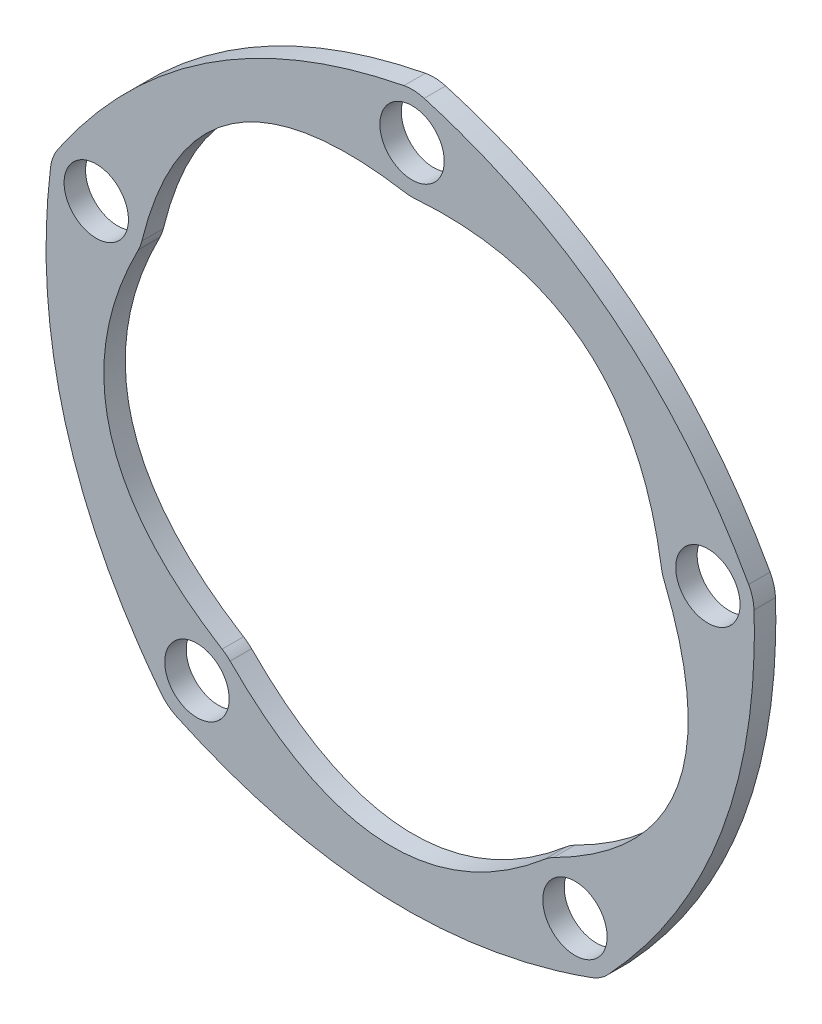
ISO-10303-21;
HEADER;
FILE_DESCRIPTION(('STEP AP214'),'2;1');
FILE_NAME('part.step','',(''),(''),'','','');
FILE_SCHEMA(('AUTOMOTIVE_DESIGN { 1 0 10303 214 1 1 1 1 }'));
ENDSEC;
DATA;
#1=APPLICATION_CONTEXT('core data for automotive mechanical design processes');
#2=APPLICATION_PROTOCOL_DEFINITION('international standard','automotive_design',2000,#1);
#3=PRODUCT_CONTEXT('',#1,'mechanical');
#4=PRODUCT('Part','Part','',(#3));
#5=PRODUCT_RELATED_PRODUCT_CATEGORY('part','',(#4));
#6=PRODUCT_DEFINITION_FORMATION('','',#4);
#7=PRODUCT_DEFINITION_CONTEXT('part definition',#1,'design');
#8=PRODUCT_DEFINITION('design','',#6,#7);
#9=PRODUCT_DEFINITION_SHAPE('','',#8);
#10=(LENGTH_UNIT() NAMED_UNIT(*) SI_UNIT(.MILLI.,.METRE.));
#11=(NAMED_UNIT(*) PLANE_ANGLE_UNIT() SI_UNIT($,.RADIAN.));
#12=(NAMED_UNIT(*) SI_UNIT($,.STERADIAN.) SOLID_ANGLE_UNIT());
#13=UNCERTAINTY_MEASURE_WITH_UNIT(LENGTH_MEASURE(1.E-05),#10,'distance_accuracy_value','');
#14=(GEOMETRIC_REPRESENTATION_CONTEXT(3) GLOBAL_UNCERTAINTY_ASSIGNED_CONTEXT((#13)) GLOBAL_UNIT_ASSIGNED_CONTEXT((#10,
#11,#12)) REPRESENTATION_CONTEXT('',''));
#15=CARTESIAN_POINT('',(0.,0.,0.));
#16=DIRECTION('',(0.,0.,1.));
#17=DIRECTION('',(1.,0.,0.));
#18=AXIS2_PLACEMENT_3D('',#15,#16,#17);
#19=CARTESIAN_POINT('',(-0.7225874508836,-16.0837765947753,1.));
#20=DIRECTION('',(0.,0.,-1.));
#21=DIRECTION('',(-1.,0.,0.));
#22=AXIS2_PLACEMENT_3D('',#19,#20,#21);
#23=PLANE('',#22);
#24=CARTESIAN_POINT('',(14.4591650686077,3.9915592841338,1.));
#25=DIRECTION('',(0.,0.,1.));
#26=DIRECTION('',(1.,0.,0.));
#27=AXIS2_PLACEMENT_3D('',#24,#25,#26);
#28=CIRCLE('',#27,1.5);
#29=CARTESIAN_POINT('',(15.9591650686077,3.9915592841338,1.));
#30=VERTEX_POINT('',#29);
#31=EDGE_CURVE('E428',#30,#30,#28,.T.);
#32=ORIENTED_EDGE('',*,*,#31,.F.);
#33=EDGE_LOOP('',(#32));
#34=FACE_BOUND('',#33,.T.);
#35=CARTESIAN_POINT('',(0.671929263318479,14.9849428115391,1.));
#36=DIRECTION('',(0.,0.,1.));
#37=DIRECTION('',(1.,0.,0.));
#38=AXIS2_PLACEMENT_3D('',#35,#36,#37);
#39=CIRCLE('',#38,1.5);
#40=CARTESIAN_POINT('',(2.17192926331848,14.9849428115391,1.));
#41=VERTEX_POINT('',#40);
#42=EDGE_CURVE('E422',#41,#41,#39,.T.);
#43=ORIENTED_EDGE('',*,*,#42,.F.);
#44=EDGE_LOOP('',(#43));
#45=FACE_BOUND('',#44,.T.);
#46=CARTESIAN_POINT('',(-14.0438899458412,5.26964469287068,1.));
#47=DIRECTION('',(0.,0.,1.));
#48=DIRECTION('',(1.,0.,0.));
#49=AXIS2_PLACEMENT_3D('',#46,#47,#48);
#50=CIRCLE('',#49,1.5);
#51=CARTESIAN_POINT('',(-12.5438899458412,5.26964469287068,1.));
#52=VERTEX_POINT('',#51);
#53=EDGE_CURVE('E416',#52,#52,#50,.T.);
#54=ORIENTED_EDGE('',*,*,#53,.F.);
#55=EDGE_LOOP('',(#54));
#56=FACE_BOUND('',#55,.T.);
#57=CARTESIAN_POINT('',(-9.35153058411119,-11.7281232827095,1.));
#58=DIRECTION('',(0.,0.,1.));
#59=DIRECTION('',(1.,0.,0.));
#60=AXIS2_PLACEMENT_3D('',#57,#58,#59);
#61=CIRCLE('',#60,1.5);
#62=CARTESIAN_POINT('',(-7.85153058411119,-11.7281232827095,1.));
#63=VERTEX_POINT('',#62);
#64=EDGE_CURVE('E410',#63,#63,#61,.T.);
#65=ORIENTED_EDGE('',*,*,#64,.F.);
#66=EDGE_LOOP('',(#65));
#67=FACE_BOUND('',#66,.T.);
#68=CARTESIAN_POINT('',(8.26432619802639,-12.5180235058341,1.));
#69=DIRECTION('',(0.,0.,1.));
#70=DIRECTION('',(1.,0.,0.));
#71=AXIS2_PLACEMENT_3D('',#68,#69,#70);
#72=CIRCLE('',#71,1.5);
#73=CARTESIAN_POINT('',(9.76432619802639,-12.5180235058341,1.));
#74=VERTEX_POINT('',#73);
#75=EDGE_CURVE('E279',#74,#74,#72,.T.);
#76=ORIENTED_EDGE('',*,*,#75,.F.);
#77=EDGE_LOOP('',(#76));
#78=FACE_BOUND('',#77,.T.);
#79=CARTESIAN_POINT('',(-10.2945485686512,-13.6631739391853,1.));
#80=CARTESIAN_POINT('',(-7.14493120353343,-15.1321145708559,1.));
#81=CARTESIAN_POINT('',(-0.746064836053117,-16.7464433831318,1.));
#82=CARTESIAN_POINT('',(5.74855557004098,-15.7101877934842,1.));
#83=CARTESIAN_POINT('',(9.02756434835693,-14.5300447370841,1.));
#84=B_SPLINE_CURVE_WITH_KNOTS('',3,(#79,#80,#81,#82,#83),.UNSPECIFIED.,.F.,.F.,(4,1,4),
(0.0220093067629684,0.500040658056157,0.977935257720578),.UNSPECIFIED.);
#85=CARTESIAN_POINT('',(-10.2945485686512,-13.6631739391853,1.));
#86=VERTEX_POINT('',#85);
#87=CARTESIAN_POINT('',(9.02756434835693,-14.5300447370841,1.));
#88=VERTEX_POINT('',#87);
#89=EDGE_CURVE('E320',#86,#88,#84,.T.);
#90=ORIENTED_EDGE('',*,*,#89,.T.);
#91=CARTESIAN_POINT('',(8.35027788408503,-12.6482150303056,1.));
#92=DIRECTION('',(0.,0.,1.));
#93=DIRECTION('',(1.,0.,0.));
#94=AXIS2_PLACEMENT_3D('',#91,#92,#93);
#95=CIRCLE('',#94,2.);
#96=CARTESIAN_POINT('',(9.81467170302321,-14.0104010466249,1.));
#97=VERTEX_POINT('',#96);
#98=EDGE_CURVE('E395',#88,#97,#95,.T.);
#99=ORIENTED_EDGE('',*,*,#98,.T.);
#100=CARTESIAN_POINT('',(9.81467170302322,-14.0104010466249,1.));
#101=CARTESIAN_POINT('',(12.1882232800694,-11.4587566920972,1.));
#102=CARTESIAN_POINT('',(15.6928634936842,-5.893557838558,1.));
#103=CARTESIAN_POINT('',(16.7224500185464,0.624994049095379,1.));
#104=CARTESIAN_POINT('',(16.6091125459754,4.09847115726541,1.));
#105=B_SPLINE_CURVE_WITH_KNOTS('',3,(#100,#101,#102,#103,#104),.UNSPECIFIED.,.F.,.F.,(4,1,4),
(0.0220647422795328,0.499959337990224,0.977990906497731),.UNSPECIFIED.);
#106=CARTESIAN_POINT('',(16.6091125459754,4.09847115726541,1.));
#107=VERTEX_POINT('',#106);
#108=EDGE_CURVE('E350',#97,#107,#105,.T.);
#109=ORIENTED_EDGE('',*,*,#108,.T.);
#110=CARTESIAN_POINT('',(14.6101763742933,4.03324707014062,1.));
#111=DIRECTION('',(0.,0.,1.));
#112=DIRECTION('',(-1.,0.,0.));
#113=AXIS2_PLACEMENT_3D('',#110,#111,#112);
#114=CIRCLE('',#113,2.);
#115=CARTESIAN_POINT('',(16.3594791371282,5.00275201800743,1.));
#116=VERTEX_POINT('',#115);
#117=EDGE_CURVE('E370',#107,#116,#114,.T.);
#118=ORIENTED_EDGE('',*,*,#117,.T.);
#119=CARTESIAN_POINT('',(16.3594791371282,5.00275201800744,1.));
#120=CARTESIAN_POINT('',(14.6748064145174,8.04245042761333,1.));
#121=CARTESIAN_POINT('',(10.4468929956077,13.1096306342383,1.));
#122=CARTESIAN_POINT('',(4.58353751879752,16.0887251038509,1.));
#123=CARTESIAN_POINT('',(1.23709303597373,17.0613223094147,1.));
#124=B_SPLINE_CURVE_WITH_KNOTS('',3,(#119,#120,#121,#122,#123),.UNSPECIFIED.,.F.,.F.,(4,1,4),
(0.0220090935023598,0.500040662009881,0.977935257720579),.UNSPECIFIED.);
#125=CARTESIAN_POINT('',(1.23709303597373,17.0613223094147,1.));
#126=VERTEX_POINT('',#125);
#127=EDGE_CURVE('E366',#116,#126,#124,.T.);
#128=ORIENTED_EDGE('',*,*,#127,.T.);
#129=CARTESIAN_POINT('',(0.678917546659587,15.1407911008349,1.));
#130=DIRECTION('',(0.,0.,1.));
#131=DIRECTION('',(-1.,0.,0.));
#132=AXIS2_PLACEMENT_3D('',#129,#130,#131);
#133=CIRCLE('',#132,2.);
#134=CARTESIAN_POINT('',(0.294870911952471,17.1035718278572,1.));
#135=VERTEX_POINT('',#134);
#136=EDGE_CURVE('E369',#126,#135,#133,.T.);
#137=ORIENTED_EDGE('',*,*,#136,.T.);
#138=CARTESIAN_POINT('',(0.294870911952471,17.1035718278572,1.));
#139=CARTESIAN_POINT('',(-3.12520065934517,16.4343850158352,1.));
#140=CARTESIAN_POINT('',(-9.23117248088857,13.9922214878203,1.));
#141=CARTESIAN_POINT('',(-13.8954472360134,9.32423879168173,1.));
#142=CARTESIAN_POINT('',(-15.8452368633433,6.44809531419616,1.));
#143=B_SPLINE_CURVE_WITH_KNOTS('',3,(#138,#139,#140,#141,#142),.UNSPECIFIED.,.F.,.F.,(4,1,4),
(0.0220647422795312,0.499960607846866,0.977922401532369),.UNSPECIFIED.);
#144=CARTESIAN_POINT('',(-15.8452368633433,6.44809531419616,1.));
#145=VERTEX_POINT('',#144);
#146=EDGE_CURVE('E372',#135,#145,#143,.T.);
#147=ORIENTED_EDGE('',*,*,#146,.T.);
#148=CARTESIAN_POINT('',(-14.1897829332749,5.32583318553774,1.));
#149=DIRECTION('',(0.,0.,1.));
#150=DIRECTION('',(-1.,0.,0.));
#151=AXIS2_PLACEMENT_3D('',#148,#149,#150);
#152=CIRCLE('',#151,2.);
#153=CARTESIAN_POINT('',(-16.1751631450614,5.56721548531626,1.));
#154=VERTEX_POINT('',#153);
#155=EDGE_CURVE('E266',#145,#154,#152,.T.);
#156=ORIENTED_EDGE('',*,*,#155,.T.);
#157=CARTESIAN_POINT('',(-16.1751631450614,5.56721548531626,1.));
#158=CARTESIAN_POINT('',(-16.5958316918051,2.10719787345245,1.));
#159=CARTESIAN_POINT('',(-16.1601616938745,-4.45559691966833,1.));
#160=CARTESIAN_POINT('',(-13.1613878674114,-10.3348100295877,1.));
#161=CARTESIAN_POINT('',(-11.0280342608291,-13.0783199092175,1.));
#162=B_SPLINE_CURVE_WITH_KNOTS('',3,(#157,#158,#159,#160,#161),.UNSPECIFIED.,.F.,.F.,(4,1,4),
(0.0219964906754167,0.499960842518189,0.977990945472958),.UNSPECIFIED.);
#163=CARTESIAN_POINT('',(-11.0280342608291,-13.0783199092175,1.));
#164=VERTEX_POINT('',#163);
#165=EDGE_CURVE('E259',#154,#164,#162,.T.);
#166=ORIENTED_EDGE('',*,*,#165,.T.);
#167=CARTESIAN_POINT('',(-9.44919390299149,-11.850613460402,1.));
#168=DIRECTION('',(0.,0.,1.));
#169=DIRECTION('',(1.,0.,0.));
#170=AXIS2_PLACEMENT_3D('',#167,#168,#169);
#171=CIRCLE('',#170,2.);
#172=EDGE_CURVE('E265',#164,#86,#171,.T.);
#173=ORIENTED_EDGE('',*,*,#172,.T.);
#174=EDGE_LOOP('',(#90,#99,#109,#118,#128,#137,#147,#156,#166,#173));
#175=FACE_BOUND('',#174,.T.);
#176=CARTESIAN_POINT('',(-12.084118166619,4.2842591861335,1.));
#177=CARTESIAN_POINT('',(-13.6120764525469,1.3225019071678,1.));
#178=CARTESIAN_POINT('',(-14.4910747022248,-3.98876784383388,1.));
#179=CARTESIAN_POINT('',(-11.0020689705511,-8.13675989612005,1.));
#180=CARTESIAN_POINT('',(-8.17835408446109,-9.87585599101951,1.));
#181=B_SPLINE_CURVE_WITH_KNOTS('',3,(#176,#177,#178,#179,#180),.UNSPECIFIED.,.F.,.F.,(4,1,4),
(0.0114631274265093,0.499980131957314,0.988311969340074),.UNSPECIFIED.);
#182=CARTESIAN_POINT('',(-12.084118166619,4.2842591861335,1.));
#183=VERTEX_POINT('',#182);
#184=CARTESIAN_POINT('',(-8.1783540844611,-9.8758559910195,1.));
#185=VERTEX_POINT('',#184);
#186=EDGE_CURVE('E173',#183,#185,#181,.T.);
#187=ORIENTED_EDGE('',*,*,#186,.F.);
#188=CARTESIAN_POINT('',(-13.8615283686821,5.20121773132635,1.));
#189=DIRECTION('',(0.,0.,-1.));
#190=DIRECTION('',(1.,0.,0.));
#191=AXIS2_PLACEMENT_3D('',#188,#189,#190);
#192=CIRCLE('',#191,2.);
#193=CARTESIAN_POINT('',(-11.919642266821,4.72259641191108,1.));
#194=VERTEX_POINT('',#193);
#195=EDGE_CURVE('E450',#194,#183,#192,.T.);
#196=ORIENTED_EDGE('',*,*,#195,.F.);
#197=CARTESIAN_POINT('',(0.333250801592804,12.8187621332053,1.));
#198=CARTESIAN_POINT('',(-2.93566670195364,13.365509179774,1.));
#199=CARTESIAN_POINT('',(-8.29108005677135,12.5358057274438,1.));
#200=CARTESIAN_POINT('',(-11.1220737936532,7.95853068917944,1.));
#201=CARTESIAN_POINT('',(-11.919642266821,4.72259641191108,1.));
#202=B_SPLINE_CURVE_WITH_KNOTS('',3,(#197,#198,#199,#200,#201),.UNSPECIFIED.,.F.,.F.,(4,1,4),
(0.011876539238313,0.500003958949868,0.988536872573951),.UNSPECIFIED.);
#203=CARTESIAN_POINT('',(0.333250801592804,12.8187621332053,1.));
#204=VERTEX_POINT('',#203);
#205=EDGE_CURVE('E502',#204,#194,#202,.T.);
#206=ORIENTED_EDGE('',*,*,#205,.F.);
#207=CARTESIAN_POINT('',(0.663180396722259,14.7913610438452,1.));
#208=DIRECTION('',(0.,0.,-1.));
#209=DIRECTION('',(1.,0.,0.));
#210=AXIS2_PLACEMENT_3D('',#207,#208,#209);
#211=CIRCLE('',#210,2.);
#212=CARTESIAN_POINT('',(0.815368632523264,12.7971597649158,1.));
#213=VERTEX_POINT('',#212);
#214=EDGE_CURVE('E507',#213,#204,#211,.T.);
#215=ORIENTED_EDGE('',*,*,#214,.F.);
#216=CARTESIAN_POINT('',(12.2938984608426,3.64062968230107,1.));
#217=CARTESIAN_POINT('',(11.7888187813505,6.9328977033719,1.));
#218=CARTESIAN_POINT('',(9.37856004411492,11.743845098,1.));
#219=CARTESIAN_POINT('',(4.1199580641915,13.0493507754053,1.));
#220=CARTESIAN_POINT('',(0.815368632523262,12.7971597649158,1.));
#221=B_SPLINE_CURVE_WITH_KNOTS('',3,(#216,#217,#218,#219,#220),.UNSPECIFIED.,.F.,.F.,(4,1,4),
(0.011651072583939,0.499978932427297,0.988122792690125),.UNSPECIFIED.);
#222=CARTESIAN_POINT('',(12.2938984608426,3.64062968230107,1.));
#223=VERTEX_POINT('',#222);
#224=EDGE_CURVE('E528',#223,#213,#221,.T.);
#225=ORIENTED_EDGE('',*,*,#224,.F.);
#226=CARTESIAN_POINT('',(14.2707701031871,3.94390927227441,1.));
#227=DIRECTION('',(0.,0.,-1.));
#228=DIRECTION('',(1.,0.,0.));
#229=AXIS2_PLACEMENT_3D('',#226,#227,#228);
#230=CIRCLE('',#229,2.);
#231=CARTESIAN_POINT('',(12.421347321181,3.18257138841682,1.));
#232=VERTEX_POINT('',#231);
#233=EDGE_CURVE('E533',#232,#223,#230,.T.);
#234=ORIENTED_EDGE('',*,*,#233,.F.);
#235=CARTESIAN_POINT('',(7.26146723460037,-10.5671762527277,1.));
#236=CARTESIAN_POINT('',(10.2364272410578,-9.06949804782472,1.));
#237=CARTESIAN_POINT('',(14.0680622262569,-5.28940284030087,1.));
#238=CARTESIAN_POINT('',(13.6836976385289,0.116101841483871,1.));
#239=CARTESIAN_POINT('',(12.421347321181,3.18257138841681,1.));
#240=B_SPLINE_CURVE_WITH_KNOTS('',3,(#235,#236,#237,#238,#239),.UNSPECIFIED.,.F.,.F.,(4,1,4),
(0.011651023358664,0.499963296867091,0.988308235650983),.UNSPECIFIED.);
#241=CARTESIAN_POINT('',(7.26146723460037,-10.5671762527277,1.));
#242=VERTEX_POINT('',#241);
#243=EDGE_CURVE('E537',#242,#232,#240,.T.);
#244=ORIENTED_EDGE('',*,*,#243,.F.);
#245=CARTESIAN_POINT('',(8.16079010833961,-12.3535744078905,1.));
#246=DIRECTION('',(0.,0.,-1.));
#247=DIRECTION('',(-1.,0.,0.));
#248=AXIS2_PLACEMENT_3D('',#245,#246,#247);
#249=CIRCLE('',#248,2.);
#250=CARTESIAN_POINT('',(6.8652132206521,-10.8299338570749,1.));
#251=VERTEX_POINT('',#250);
#252=EDGE_CURVE('E196',#251,#242,#249,.T.);
#253=ORIENTED_EDGE('',*,*,#252,.F.);
#254=CARTESIAN_POINT('',(-7.80610848753519,-10.1714589191265,1.));
#255=CARTESIAN_POINT('',(-5.46240352248118,-12.5380358706394,1.));
#256=CARTESIAN_POINT('',(-0.683269899292186,-15.0140438876958,1.));
#257=CARTESIAN_POINT('',(4.33891095939803,-12.9780906642965,1.));
#258=CARTESIAN_POINT('',(6.86521322065211,-10.8299338570749,1.));
#259=B_SPLINE_CURVE_WITH_KNOTS('',3,(#254,#255,#256,#257,#258),.UNSPECIFIED.,.F.,.F.,(4,1,4),
(0.0116480068997646,0.499963567054202,0.988308295603419),.UNSPECIFIED.);
#260=CARTESIAN_POINT('',(-7.80610848753519,-10.1714589191265,1.));
#261=VERTEX_POINT('',#260);
#262=EDGE_CURVE('E194',#261,#251,#259,.T.);
#263=ORIENTED_EDGE('',*,*,#262,.F.);
#264=CARTESIAN_POINT('',(-9.22717237484123,-11.5787888122911,1.));
#265=DIRECTION('',(0.,0.,-1.));
#266=DIRECTION('',(1.,0.,0.));
#267=AXIS2_PLACEMENT_3D('',#264,#265,#266);
#268=CIRCLE('',#267,2.);
#269=EDGE_CURVE('E181',#185,#261,#268,.T.);
#270=ORIENTED_EDGE('',*,*,#269,.F.);
#271=EDGE_LOOP('',(#187,#196,#206,#215,#225,#234,#244,#253,#263,#270));
#272=FACE_BOUND('',#271,.T.);
#273=ADVANCED_FACE('F35',(#34,#45,#56,#67,#78,#175,#272),#23,.F.);
#274=CARTESIAN_POINT('',(-0.7225874508836,-16.0837765947753,0.));
#275=DIRECTION('',(0.,0.,-1.));
#276=DIRECTION('',(-1.,0.,0.));
#277=AXIS2_PLACEMENT_3D('',#274,#275,#276);
#278=PLANE('',#277);
#279=CARTESIAN_POINT('',(0.671929263318479,14.9849428115391,0.));
#280=DIRECTION('',(0.,0.,1.));
#281=DIRECTION('',(1.,0.,0.));
#282=AXIS2_PLACEMENT_3D('',#279,#280,#281);
#283=CIRCLE('',#282,1.5);
#284=CARTESIAN_POINT('',(2.17192926331848,14.9849428115391,0.));
#285=VERTEX_POINT('',#284);
#286=EDGE_CURVE('E425',#285,#285,#283,.T.);
#287=ORIENTED_EDGE('',*,*,#286,.T.);
#288=EDGE_LOOP('',(#287));
#289=FACE_BOUND('',#288,.T.);
#290=CARTESIAN_POINT('',(-9.35153058411119,-11.7281232827095,0.));
#291=DIRECTION('',(0.,0.,1.));
#292=DIRECTION('',(1.,0.,0.));
#293=AXIS2_PLACEMENT_3D('',#290,#291,#292);
#294=CIRCLE('',#293,1.5);
#295=CARTESIAN_POINT('',(-7.85153058411119,-11.7281232827095,0.));
#296=VERTEX_POINT('',#295);
#297=EDGE_CURVE('E413',#296,#296,#294,.T.);
#298=ORIENTED_EDGE('',*,*,#297,.T.);
#299=EDGE_LOOP('',(#298));
#300=FACE_BOUND('',#299,.T.);
#301=CARTESIAN_POINT('',(-10.2945485686512,-13.6631739391853,0.));
#302=CARTESIAN_POINT('',(-7.14493120353343,-15.1321145708559,0.));
#303=CARTESIAN_POINT('',(-0.746064836053117,-16.7464433831318,0.));
#304=CARTESIAN_POINT('',(5.74855557004098,-15.7101877934842,0.));
#305=CARTESIAN_POINT('',(9.02756434835693,-14.5300447370841,0.));
#306=B_SPLINE_CURVE_WITH_KNOTS('',3,(#301,#302,#303,#304,#305),.UNSPECIFIED.,.F.,.F.,(4,1,4),
(0.0220093067629684,0.500040658056157,0.977935257720578),.UNSPECIFIED.);
#307=CARTESIAN_POINT('',(-10.2945485686512,-13.6631739391853,0.));
#308=VERTEX_POINT('',#307);
#309=CARTESIAN_POINT('',(9.02756434835693,-14.5300447370841,0.));
#310=VERTEX_POINT('',#309);
#311=EDGE_CURVE('E273',#308,#310,#306,.T.);
#312=ORIENTED_EDGE('',*,*,#311,.F.);
#313=CARTESIAN_POINT('',(-9.44919390299149,-11.850613460402,0.));
#314=DIRECTION('',(0.,0.,1.));
#315=DIRECTION('',(1.,0.,0.));
#316=AXIS2_PLACEMENT_3D('',#313,#314,#315);
#317=CIRCLE('',#316,2.);
#318=CARTESIAN_POINT('',(-11.0280342608291,-13.0783199092175,0.));
#319=VERTEX_POINT('',#318);
#320=EDGE_CURVE('E315',#319,#308,#317,.T.);
#321=ORIENTED_EDGE('',*,*,#320,.F.);
#322=CARTESIAN_POINT('',(-16.1751631450614,5.56721548531626,0.));
#323=CARTESIAN_POINT('',(-16.5958316918051,2.10719787345245,0.));
#324=CARTESIAN_POINT('',(-16.1601616938745,-4.45559691966833,0.));
#325=CARTESIAN_POINT('',(-13.1613878674114,-10.3348100295877,0.));
#326=CARTESIAN_POINT('',(-11.0280342608291,-13.0783199092175,0.));
#327=B_SPLINE_CURVE_WITH_KNOTS('',3,(#322,#323,#324,#325,#326),.UNSPECIFIED.,.F.,.F.,(4,1,4),
(0.0219964906754167,0.499960842518189,0.977990945472958),.UNSPECIFIED.);
#328=CARTESIAN_POINT('',(-16.1751631450614,5.56721548531626,0.));
#329=VERTEX_POINT('',#328);
#330=EDGE_CURVE('E311',#329,#319,#327,.T.);
#331=ORIENTED_EDGE('',*,*,#330,.F.);
#332=CARTESIAN_POINT('',(-14.1897829332749,5.32583318553774,0.));
#333=DIRECTION('',(0.,0.,1.));
#334=DIRECTION('',(-1.,0.,0.));
#335=AXIS2_PLACEMENT_3D('',#332,#333,#334);
#336=CIRCLE('',#335,2.);
#337=CARTESIAN_POINT('',(-15.8452368633433,6.44809531419616,0.));
#338=VERTEX_POINT('',#337);
#339=EDGE_CURVE('E306',#338,#329,#336,.T.);
#340=ORIENTED_EDGE('',*,*,#339,.F.);
#341=CARTESIAN_POINT('',(0.294870911952471,17.1035718278572,0.));
#342=CARTESIAN_POINT('',(-3.12520065934517,16.4343850158352,0.));
#343=CARTESIAN_POINT('',(-9.23117248088857,13.9922214878203,0.));
#344=CARTESIAN_POINT('',(-13.8954472360134,9.32423879168173,0.));
#345=CARTESIAN_POINT('',(-15.8452368633433,6.44809531419616,0.));
#346=B_SPLINE_CURVE_WITH_KNOTS('',3,(#341,#342,#343,#344,#345),.UNSPECIFIED.,.F.,.F.,(4,1,4),
(0.0220647422795312,0.499960607846866,0.977922401532369),.UNSPECIFIED.);
#347=CARTESIAN_POINT('',(0.294870911952471,17.1035718278572,0.));
#348=VERTEX_POINT('',#347);
#349=EDGE_CURVE('E302',#348,#338,#346,.T.);
#350=ORIENTED_EDGE('',*,*,#349,.F.);
#351=CARTESIAN_POINT('',(0.678917546659587,15.1407911008349,0.));
#352=DIRECTION('',(0.,0.,1.));
#353=DIRECTION('',(-1.,0.,0.));
#354=AXIS2_PLACEMENT_3D('',#351,#352,#353);
#355=CIRCLE('',#354,2.);
#356=CARTESIAN_POINT('',(1.23709303597373,17.0613223094147,0.));
#357=VERTEX_POINT('',#356);
#358=EDGE_CURVE('E297',#357,#348,#355,.T.);
#359=ORIENTED_EDGE('',*,*,#358,.F.);
#360=CARTESIAN_POINT('',(16.3594791371282,5.00275201800744,0.));
#361=CARTESIAN_POINT('',(14.6748064145174,8.04245042761333,0.));
#362=CARTESIAN_POINT('',(10.4468929956077,13.1096306342383,0.));
#363=CARTESIAN_POINT('',(4.58353751879752,16.0887251038509,0.));
#364=CARTESIAN_POINT('',(1.23709303597373,17.0613223094147,0.));
#365=B_SPLINE_CURVE_WITH_KNOTS('',3,(#360,#361,#362,#363,#364),.UNSPECIFIED.,.F.,.F.,(4,1,4),
(0.0220090935023598,0.500040662009881,0.977935257720579),.UNSPECIFIED.);
#366=CARTESIAN_POINT('',(16.3594791371282,5.00275201800743,0.));
#367=VERTEX_POINT('',#366);
#368=EDGE_CURVE('E293',#367,#357,#365,.T.);
#369=ORIENTED_EDGE('',*,*,#368,.F.);
#370=CARTESIAN_POINT('',(14.6101763742933,4.03324707014062,0.));
#371=DIRECTION('',(0.,0.,1.));
#372=DIRECTION('',(-1.,0.,0.));
#373=AXIS2_PLACEMENT_3D('',#370,#371,#372);
#374=CIRCLE('',#373,2.);
#375=CARTESIAN_POINT('',(16.6091125459754,4.09847115726541,0.));
#376=VERTEX_POINT('',#375);
#377=EDGE_CURVE('E288',#376,#367,#374,.T.);
#378=ORIENTED_EDGE('',*,*,#377,.F.);
#379=CARTESIAN_POINT('',(9.81467170302322,-14.0104010466249,0.));
#380=CARTESIAN_POINT('',(12.1882232800694,-11.4587566920972,0.));
#381=CARTESIAN_POINT('',(15.6928634936842,-5.893557838558,0.));
#382=CARTESIAN_POINT('',(16.7224500185464,0.624994049095379,0.));
#383=CARTESIAN_POINT('',(16.6091125459754,4.09847115726541,0.));
#384=B_SPLINE_CURVE_WITH_KNOTS('',3,(#379,#380,#381,#382,#383),.UNSPECIFIED.,.F.,.F.,(4,1,4),
(0.0220647422795328,0.499959337990224,0.977990906497731),.UNSPECIFIED.);
#385=CARTESIAN_POINT('',(9.81467170302321,-14.0104010466249,0.));
#386=VERTEX_POINT('',#385);
#387=EDGE_CURVE('E284',#386,#376,#384,.T.);
#388=ORIENTED_EDGE('',*,*,#387,.F.);
#389=CARTESIAN_POINT('',(8.35027788408503,-12.6482150303056,0.));
#390=DIRECTION('',(0.,0.,1.));
#391=DIRECTION('',(1.,0.,0.));
#392=AXIS2_PLACEMENT_3D('',#389,#390,#391);
#393=CIRCLE('',#392,2.);
#394=EDGE_CURVE('E278',#310,#386,#393,.T.);
#395=ORIENTED_EDGE('',*,*,#394,.F.);
#396=EDGE_LOOP('',(#312,#321,#331,#340,#350,#359,#369,#378,#388,#395));
#397=FACE_BOUND('',#396,.T.);
#398=CARTESIAN_POINT('',(8.26432619802639,-12.5180235058341,0.));
#399=DIRECTION('',(0.,0.,1.));
#400=DIRECTION('',(1.,0.,0.));
#401=AXIS2_PLACEMENT_3D('',#398,#399,#400);
#402=CIRCLE('',#401,1.5);
#403=CARTESIAN_POINT('',(9.76432619802639,-12.5180235058341,0.));
#404=VERTEX_POINT('',#403);
#405=EDGE_CURVE('E404',#404,#404,#402,.T.);
#406=ORIENTED_EDGE('',*,*,#405,.T.);
#407=EDGE_LOOP('',(#406));
#408=FACE_BOUND('',#407,.T.);
#409=CARTESIAN_POINT('',(-14.0438899458412,5.26964469287068,0.));
#410=DIRECTION('',(0.,0.,1.));
#411=DIRECTION('',(1.,0.,0.));
#412=AXIS2_PLACEMENT_3D('',#409,#410,#411);
#413=CIRCLE('',#412,1.5);
#414=CARTESIAN_POINT('',(-12.5438899458412,5.26964469287068,0.));
#415=VERTEX_POINT('',#414);
#416=EDGE_CURVE('E419',#415,#415,#413,.T.);
#417=ORIENTED_EDGE('',*,*,#416,.T.);
#418=EDGE_LOOP('',(#417));
#419=FACE_BOUND('',#418,.T.);
#420=CARTESIAN_POINT('',(14.4591650686077,3.9915592841338,0.));
#421=DIRECTION('',(0.,0.,1.));
#422=DIRECTION('',(1.,0.,0.));
#423=AXIS2_PLACEMENT_3D('',#420,#421,#422);
#424=CIRCLE('',#423,1.5);
#425=CARTESIAN_POINT('',(15.9591650686077,3.9915592841338,0.));
#426=VERTEX_POINT('',#425);
#427=EDGE_CURVE('E189',#426,#426,#424,.T.);
#428=ORIENTED_EDGE('',*,*,#427,.T.);
#429=EDGE_LOOP('',(#428));
#430=FACE_BOUND('',#429,.T.);
#431=CARTESIAN_POINT('',(-13.8615283686821,5.20121773132635,0.));
#432=DIRECTION('',(0.,0.,-1.));
#433=DIRECTION('',(1.,0.,0.));
#434=AXIS2_PLACEMENT_3D('',#431,#432,#433);
#435=CIRCLE('',#434,2.);
#436=CARTESIAN_POINT('',(-11.919642266821,4.72259641191108,0.));
#437=VERTEX_POINT('',#436);
#438=CARTESIAN_POINT('',(-12.084118166619,4.2842591861335,0.));
#439=VERTEX_POINT('',#438);
#440=EDGE_CURVE('E182',#437,#439,#435,.T.);
#441=ORIENTED_EDGE('',*,*,#440,.T.);
#442=CARTESIAN_POINT('',(-12.084118166619,4.2842591861335,0.));
#443=CARTESIAN_POINT('',(-13.6120764525469,1.3225019071678,0.));
#444=CARTESIAN_POINT('',(-14.4910747022248,-3.98876784383388,0.));
#445=CARTESIAN_POINT('',(-11.0020689705511,-8.13675989612005,0.));
#446=CARTESIAN_POINT('',(-8.17835408446109,-9.87585599101951,0.));
#447=B_SPLINE_CURVE_WITH_KNOTS('',3,(#442,#443,#444,#445,#446),.UNSPECIFIED.,.F.,.F.,(4,1,4),
(0.0114631274265093,0.499980131957314,0.988311969340074),.UNSPECIFIED.);
#448=CARTESIAN_POINT('',(-8.1783540844611,-9.8758559910195,0.));
#449=VERTEX_POINT('',#448);
#450=EDGE_CURVE('E59',#439,#449,#447,.T.);
#451=ORIENTED_EDGE('',*,*,#450,.T.);
#452=CARTESIAN_POINT('',(-9.22717237484123,-11.5787888122911,0.));
#453=DIRECTION('',(0.,0.,-1.));
#454=DIRECTION('',(1.,0.,0.));
#455=AXIS2_PLACEMENT_3D('',#452,#453,#454);
#456=CIRCLE('',#455,2.);
#457=CARTESIAN_POINT('',(-7.80610848753519,-10.1714589191265,0.));
#458=VERTEX_POINT('',#457);
#459=EDGE_CURVE('E188',#449,#458,#456,.T.);
#460=ORIENTED_EDGE('',*,*,#459,.T.);
#461=CARTESIAN_POINT('',(-7.80610848753519,-10.1714589191265,0.));
#462=CARTESIAN_POINT('',(-5.46240352248118,-12.5380358706394,0.));
#463=CARTESIAN_POINT('',(-0.683269899292186,-15.0140438876958,0.));
#464=CARTESIAN_POINT('',(4.33891095939803,-12.9780906642965,0.));
#465=CARTESIAN_POINT('',(6.86521322065211,-10.8299338570749,0.));
#466=B_SPLINE_CURVE_WITH_KNOTS('',3,(#461,#462,#463,#464,#465),.UNSPECIFIED.,.F.,.F.,(4,1,4),
(0.0116480068997646,0.499963567054202,0.988308295603419),.UNSPECIFIED.);
#467=CARTESIAN_POINT('',(6.8652132206521,-10.8299338570749,0.));
#468=VERTEX_POINT('',#467);
#469=EDGE_CURVE('E486',#458,#468,#466,.T.);
#470=ORIENTED_EDGE('',*,*,#469,.T.);
#471=CARTESIAN_POINT('',(8.16079010833961,-12.3535744078905,0.));
#472=DIRECTION('',(0.,0.,-1.));
#473=DIRECTION('',(-1.,0.,0.));
#474=AXIS2_PLACEMENT_3D('',#471,#472,#473);
#475=CIRCLE('',#474,2.);
#476=CARTESIAN_POINT('',(7.26146723460037,-10.5671762527277,0.));
#477=VERTEX_POINT('',#476);
#478=EDGE_CURVE('E480',#468,#477,#475,.T.);
#479=ORIENTED_EDGE('',*,*,#478,.T.);
#480=CARTESIAN_POINT('',(7.26146723460037,-10.5671762527277,0.));
#481=CARTESIAN_POINT('',(10.2364272410578,-9.06949804782472,0.));
#482=CARTESIAN_POINT('',(14.0680622262569,-5.28940284030087,0.));
#483=CARTESIAN_POINT('',(13.6836976385289,0.116101841483871,0.));
#484=CARTESIAN_POINT('',(12.421347321181,3.18257138841681,0.));
#485=B_SPLINE_CURVE_WITH_KNOTS('',3,(#480,#481,#482,#483,#484),.UNSPECIFIED.,.F.,.F.,(4,1,4),
(0.011651023358664,0.499963296867091,0.988308235650983),.UNSPECIFIED.);
#486=CARTESIAN_POINT('',(12.421347321181,3.18257138841682,0.));
#487=VERTEX_POINT('',#486);
#488=EDGE_CURVE('E475',#477,#487,#485,.T.);
#489=ORIENTED_EDGE('',*,*,#488,.T.);
#490=CARTESIAN_POINT('',(14.2707701031871,3.94390927227441,0.));
#491=DIRECTION('',(0.,0.,-1.));
#492=DIRECTION('',(1.,0.,0.));
#493=AXIS2_PLACEMENT_3D('',#490,#491,#492);
#494=CIRCLE('',#493,2.);
#495=CARTESIAN_POINT('',(12.2938984608426,3.64062968230107,0.));
#496=VERTEX_POINT('',#495);
#497=EDGE_CURVE('E469',#487,#496,#494,.T.);
#498=ORIENTED_EDGE('',*,*,#497,.T.);
#499=CARTESIAN_POINT('',(12.2938984608426,3.64062968230107,0.));
#500=CARTESIAN_POINT('',(11.7888187813505,6.9328977033719,0.));
#501=CARTESIAN_POINT('',(9.37856004411492,11.743845098,0.));
#502=CARTESIAN_POINT('',(4.1199580641915,13.0493507754053,0.));
#503=CARTESIAN_POINT('',(0.815368632523262,12.7971597649158,0.));
#504=B_SPLINE_CURVE_WITH_KNOTS('',3,(#499,#500,#501,#502,#503),.UNSPECIFIED.,.F.,.F.,(4,1,4),
(0.011651072583939,0.499978932427297,0.988122792690125),.UNSPECIFIED.);
#505=CARTESIAN_POINT('',(0.815368632523264,12.7971597649158,0.));
#506=VERTEX_POINT('',#505);
#507=EDGE_CURVE('E464',#496,#506,#504,.T.);
#508=ORIENTED_EDGE('',*,*,#507,.T.);
#509=CARTESIAN_POINT('',(0.663180396722259,14.7913610438452,0.));
#510=DIRECTION('',(0.,0.,-1.));
#511=DIRECTION('',(1.,0.,0.));
#512=AXIS2_PLACEMENT_3D('',#509,#510,#511);
#513=CIRCLE('',#512,2.);
#514=CARTESIAN_POINT('',(0.333250801592804,12.8187621332053,0.));
#515=VERTEX_POINT('',#514);
#516=EDGE_CURVE('E458',#506,#515,#513,.T.);
#517=ORIENTED_EDGE('',*,*,#516,.T.);
#518=CARTESIAN_POINT('',(0.333250801592804,12.8187621332053,0.));
#519=CARTESIAN_POINT('',(-2.93566670195364,13.365509179774,0.));
#520=CARTESIAN_POINT('',(-8.29108005677135,12.5358057274438,0.));
#521=CARTESIAN_POINT('',(-11.1220737936532,7.95853068917944,0.));
#522=CARTESIAN_POINT('',(-11.919642266821,4.72259641191108,0.));
#523=B_SPLINE_CURVE_WITH_KNOTS('',3,(#518,#519,#520,#521,#522),.UNSPECIFIED.,.F.,.F.,(4,1,4),
(0.011876539238313,0.500003958949868,0.988536872573951),.UNSPECIFIED.);
#524=EDGE_CURVE('E453',#515,#437,#523,.T.);
#525=ORIENTED_EDGE('',*,*,#524,.T.);
#526=EDGE_LOOP('',(#441,#451,#460,#470,#479,#489,#498,#508,#517,#525));
#527=FACE_BOUND('',#526,.T.);
#528=ADVANCED_FACE('F244',(#289,#300,#397,#408,#419,#430,#527),#278,.T.);
#529=DIRECTION('',(0.,0.,-1.));
#530=VECTOR('',#529,1.);
#531=SURFACE_OF_LINEAR_EXTRUSION('',#84,#530);
#532=ORIENTED_EDGE('',*,*,#311,.T.);
#533=DIRECTION('',(0.,0.,-1.));
#534=VECTOR('',#533,1.);
#535=CARTESIAN_POINT('',(9.02756434835693,-14.5300447370841,1.));
#536=LINE('',#535,#534);
#537=EDGE_CURVE('E11',#88,#310,#536,.T.);
#538=ORIENTED_EDGE('',*,*,#537,.F.);
#539=ORIENTED_EDGE('',*,*,#89,.F.);
#540=DIRECTION('',(0.,0.,-1.));
#541=VECTOR('',#540,1.);
#542=CARTESIAN_POINT('',(-10.2945485686512,-13.6631739391853,1.));
#543=LINE('',#542,#541);
#544=EDGE_CURVE('E272',#86,#308,#543,.T.);
#545=ORIENTED_EDGE('',*,*,#544,.T.);
#546=EDGE_LOOP('',(#532,#538,#539,#545));
#547=FACE_BOUND('',#546,.T.);
#548=ADVANCED_FACE('F37',(#547),#531,.F.);
#549=CARTESIAN_POINT('',(8.35027788408503,-12.6482150303056,1.));
#550=DIRECTION('',(0.,0.,-1.));
#551=DIRECTION('',(-1.,0.,0.));
#552=AXIS2_PLACEMENT_3D('',#549,#550,#551);
#553=CYLINDRICAL_SURFACE('',#552,2.);
#554=ORIENTED_EDGE('',*,*,#394,.T.);
#555=DIRECTION('',(0.,0.,-1.));
#556=VECTOR('',#555,1.);
#557=CARTESIAN_POINT('',(9.81467170302321,-14.0104010466249,1.));
#558=LINE('',#557,#556);
#559=EDGE_CURVE('E44',#97,#386,#558,.T.);
#560=ORIENTED_EDGE('',*,*,#559,.F.);
#561=ORIENTED_EDGE('',*,*,#98,.F.);
#562=ORIENTED_EDGE('',*,*,#537,.T.);
#563=EDGE_LOOP('',(#554,#560,#561,#562));
#564=FACE_BOUND('',#563,.T.);
#565=ADVANCED_FACE('F390',(#564),#553,.T.);
#566=DIRECTION('',(0.,0.,-1.));
#567=VECTOR('',#566,1.);
#568=SURFACE_OF_LINEAR_EXTRUSION('',#105,#567);
#569=ORIENTED_EDGE('',*,*,#387,.T.);
#570=DIRECTION('',(0.,0.,-1.));
#571=VECTOR('',#570,1.);
#572=CARTESIAN_POINT('',(16.6091125459754,4.09847115726541,1.));
#573=LINE('',#572,#571);
#574=EDGE_CURVE('E341',#107,#376,#573,.T.);
#575=ORIENTED_EDGE('',*,*,#574,.F.);
#576=ORIENTED_EDGE('',*,*,#108,.F.);
#577=ORIENTED_EDGE('',*,*,#559,.T.);
#578=EDGE_LOOP('',(#569,#575,#576,#577));
#579=FACE_BOUND('',#578,.T.);
#580=ADVANCED_FACE('F348',(#579),#568,.F.);
#581=CARTESIAN_POINT('',(14.6101763742933,4.03324707014062,1.));
#582=DIRECTION('',(0.,0.,-1.));
#583=DIRECTION('',(-1.,0.,0.));
#584=AXIS2_PLACEMENT_3D('',#581,#582,#583);
#585=CYLINDRICAL_SURFACE('',#584,2.);
#586=ORIENTED_EDGE('',*,*,#377,.T.);
#587=DIRECTION('',(0.,0.,-1.));
#588=VECTOR('',#587,1.);
#589=CARTESIAN_POINT('',(16.3594791371282,5.00275201800743,1.));
#590=LINE('',#589,#588);
#591=EDGE_CURVE('E338',#116,#367,#590,.T.);
#592=ORIENTED_EDGE('',*,*,#591,.F.);
#593=ORIENTED_EDGE('',*,*,#117,.F.);
#594=ORIENTED_EDGE('',*,*,#574,.T.);
#595=EDGE_LOOP('',(#586,#592,#593,#594));
#596=FACE_BOUND('',#595,.T.);
#597=ADVANCED_FACE('F360',(#596),#585,.T.);
#598=DIRECTION('',(0.,0.,-1.));
#599=VECTOR('',#598,1.);
#600=SURFACE_OF_LINEAR_EXTRUSION('',#124,#599);
#601=ORIENTED_EDGE('',*,*,#368,.T.);
#602=DIRECTION('',(0.,0.,-1.));
#603=VECTOR('',#602,1.);
#604=CARTESIAN_POINT('',(1.23709303597373,17.0613223094147,1.));
#605=LINE('',#604,#603);
#606=EDGE_CURVE('E335',#126,#357,#605,.T.);
#607=ORIENTED_EDGE('',*,*,#606,.F.);
#608=ORIENTED_EDGE('',*,*,#127,.F.);
#609=ORIENTED_EDGE('',*,*,#591,.T.);
#610=EDGE_LOOP('',(#601,#607,#608,#609));
#611=FACE_BOUND('',#610,.T.);
#612=ADVANCED_FACE('F364',(#611),#600,.F.);
#613=CARTESIAN_POINT('',(0.678917546659587,15.1407911008349,1.));
#614=DIRECTION('',(0.,0.,-1.));
#615=DIRECTION('',(-1.,0.,0.));
#616=AXIS2_PLACEMENT_3D('',#613,#614,#615);
#617=CYLINDRICAL_SURFACE('',#616,2.);
#618=ORIENTED_EDGE('',*,*,#358,.T.);
#619=DIRECTION('',(0.,0.,-1.));
#620=VECTOR('',#619,1.);
#621=CARTESIAN_POINT('',(0.294870911952471,17.1035718278572,1.));
#622=LINE('',#621,#620);
#623=EDGE_CURVE('E332',#135,#348,#622,.T.);
#624=ORIENTED_EDGE('',*,*,#623,.F.);
#625=ORIENTED_EDGE('',*,*,#136,.F.);
#626=ORIENTED_EDGE('',*,*,#606,.T.);
#627=EDGE_LOOP('',(#618,#624,#625,#626));
#628=FACE_BOUND('',#627,.T.);
#629=ADVANCED_FACE('F386',(#628),#617,.T.);
#630=DIRECTION('',(0.,0.,-1.));
#631=VECTOR('',#630,1.);
#632=SURFACE_OF_LINEAR_EXTRUSION('',#143,#631);
#633=ORIENTED_EDGE('',*,*,#349,.T.);
#634=DIRECTION('',(0.,0.,-1.));
#635=VECTOR('',#634,1.);
#636=CARTESIAN_POINT('',(-15.8452368633433,6.44809531419616,1.));
#637=LINE('',#636,#635);
#638=EDGE_CURVE('E329',#145,#338,#637,.T.);
#639=ORIENTED_EDGE('',*,*,#638,.F.);
#640=ORIENTED_EDGE('',*,*,#146,.F.);
#641=ORIENTED_EDGE('',*,*,#623,.T.);
#642=EDGE_LOOP('',(#633,#639,#640,#641));
#643=FACE_BOUND('',#642,.T.);
#644=ADVANCED_FACE('F670',(#643),#632,.F.);
#645=CARTESIAN_POINT('',(-14.1897829332749,5.32583318553774,1.));
#646=DIRECTION('',(0.,0.,-1.));
#647=DIRECTION('',(-1.,0.,0.));
#648=AXIS2_PLACEMENT_3D('',#645,#646,#647);
#649=CYLINDRICAL_SURFACE('',#648,2.);
#650=ORIENTED_EDGE('',*,*,#339,.T.);
#651=DIRECTION('',(0.,0.,-1.));
#652=VECTOR('',#651,1.);
#653=CARTESIAN_POINT('',(-16.1751631450614,5.56721548531626,1.));
#654=LINE('',#653,#652);
#655=EDGE_CURVE('E326',#154,#329,#654,.T.);
#656=ORIENTED_EDGE('',*,*,#655,.F.);
#657=ORIENTED_EDGE('',*,*,#155,.F.);
#658=ORIENTED_EDGE('',*,*,#638,.T.);
#659=EDGE_LOOP('',(#650,#656,#657,#658));
#660=FACE_BOUND('',#659,.T.);
#661=ADVANCED_FACE('F256',(#660),#649,.T.);
#662=DIRECTION('',(0.,0.,-1.));
#663=VECTOR('',#662,1.);
#664=SURFACE_OF_LINEAR_EXTRUSION('',#162,#663);
#665=ORIENTED_EDGE('',*,*,#330,.T.);
#666=DIRECTION('',(0.,0.,-1.));
#667=VECTOR('',#666,1.);
#668=CARTESIAN_POINT('',(-11.0280342608291,-13.0783199092175,1.));
#669=LINE('',#668,#667);
#670=EDGE_CURVE('E323',#164,#319,#669,.T.);
#671=ORIENTED_EDGE('',*,*,#670,.F.);
#672=ORIENTED_EDGE('',*,*,#165,.F.);
#673=ORIENTED_EDGE('',*,*,#655,.T.);
#674=EDGE_LOOP('',(#665,#671,#672,#673));
#675=FACE_BOUND('',#674,.T.);
#676=ADVANCED_FACE('F251',(#675),#664,.F.);
#677=CARTESIAN_POINT('',(-9.44919390299149,-11.850613460402,1.));
#678=DIRECTION('',(0.,0.,-1.));
#679=DIRECTION('',(-1.,0.,0.));
#680=AXIS2_PLACEMENT_3D('',#677,#678,#679);
#681=CYLINDRICAL_SURFACE('',#680,2.);
#682=ORIENTED_EDGE('',*,*,#320,.T.);
#683=ORIENTED_EDGE('',*,*,#544,.F.);
#684=ORIENTED_EDGE('',*,*,#172,.F.);
#685=ORIENTED_EDGE('',*,*,#670,.T.);
#686=EDGE_LOOP('',(#682,#683,#684,#685));
#687=FACE_BOUND('',#686,.T.);
#688=ADVANCED_FACE('F240',(#687),#681,.T.);
#689=CARTESIAN_POINT('',(8.26432619802639,-12.5180235058341,1.));
#690=DIRECTION('',(0.,0.,-1.));
#691=DIRECTION('',(-1.,0.,0.));
#692=AXIS2_PLACEMENT_3D('',#689,#690,#691);
#693=CYLINDRICAL_SURFACE('',#692,1.5);
#694=ORIENTED_EDGE('',*,*,#75,.T.);
#695=EDGE_LOOP('',(#694));
#696=FACE_BOUND('',#695,.T.);
#697=ORIENTED_EDGE('',*,*,#405,.F.);
#698=EDGE_LOOP('',(#697));
#699=FACE_BOUND('',#698,.T.);
#700=ADVANCED_FACE('F236',(#696,#699),#693,.F.);
#701=CARTESIAN_POINT('',(-9.35153058411119,-11.7281232827095,1.));
#702=DIRECTION('',(0.,0.,-1.));
#703=DIRECTION('',(-1.,0.,0.));
#704=AXIS2_PLACEMENT_3D('',#701,#702,#703);
#705=CYLINDRICAL_SURFACE('',#704,1.5);
#706=ORIENTED_EDGE('',*,*,#64,.T.);
#707=EDGE_LOOP('',(#706));
#708=FACE_BOUND('',#707,.T.);
#709=ORIENTED_EDGE('',*,*,#297,.F.);
#710=EDGE_LOOP('',(#709));
#711=FACE_BOUND('',#710,.T.);
#712=ADVANCED_FACE('F232',(#708,#711),#705,.F.);
#713=CARTESIAN_POINT('',(-14.0438899458412,5.26964469287068,1.));
#714=DIRECTION('',(0.,0.,-1.));
#715=DIRECTION('',(-1.,0.,0.));
#716=AXIS2_PLACEMENT_3D('',#713,#714,#715);
#717=CYLINDRICAL_SURFACE('',#716,1.5);
#718=ORIENTED_EDGE('',*,*,#53,.T.);
#719=EDGE_LOOP('',(#718));
#720=FACE_BOUND('',#719,.T.);
#721=ORIENTED_EDGE('',*,*,#416,.F.);
#722=EDGE_LOOP('',(#721));
#723=FACE_BOUND('',#722,.T.);
#724=ADVANCED_FACE('F228',(#720,#723),#717,.F.);
#725=CARTESIAN_POINT('',(0.671929263318479,14.9849428115391,1.));
#726=DIRECTION('',(0.,0.,-1.));
#727=DIRECTION('',(-1.,0.,0.));
#728=AXIS2_PLACEMENT_3D('',#725,#726,#727);
#729=CYLINDRICAL_SURFACE('',#728,1.5);
#730=ORIENTED_EDGE('',*,*,#42,.T.);
#731=EDGE_LOOP('',(#730));
#732=FACE_BOUND('',#731,.T.);
#733=ORIENTED_EDGE('',*,*,#286,.F.);
#734=EDGE_LOOP('',(#733));
#735=FACE_BOUND('',#734,.T.);
#736=ADVANCED_FACE('F224',(#732,#735),#729,.F.);
#737=CARTESIAN_POINT('',(14.4591650686077,3.9915592841338,1.));
#738=DIRECTION('',(0.,0.,-1.));
#739=DIRECTION('',(-1.,0.,0.));
#740=AXIS2_PLACEMENT_3D('',#737,#738,#739);
#741=CYLINDRICAL_SURFACE('',#740,1.5);
#742=ORIENTED_EDGE('',*,*,#31,.T.);
#743=EDGE_LOOP('',(#742));
#744=FACE_BOUND('',#743,.T.);
#745=ORIENTED_EDGE('',*,*,#427,.F.);
#746=EDGE_LOOP('',(#745));
#747=FACE_BOUND('',#746,.T.);
#748=ADVANCED_FACE('F221',(#744,#747),#741,.F.);
#749=DIRECTION('',(0.,0.,-1.));
#750=VECTOR('',#749,1.);
#751=SURFACE_OF_LINEAR_EXTRUSION('',#181,#750);
#752=ORIENTED_EDGE('',*,*,#450,.F.);
#753=DIRECTION('',(0.,0.,-1.));
#754=VECTOR('',#753,1.);
#755=CARTESIAN_POINT('',(-12.084118166619,4.2842591861335,1.));
#756=LINE('',#755,#754);
#757=EDGE_CURVE('E177',#183,#439,#756,.T.);
#758=ORIENTED_EDGE('',*,*,#757,.F.);
#759=ORIENTED_EDGE('',*,*,#186,.T.);
#760=DIRECTION('',(0.,0.,-1.));
#761=VECTOR('',#760,1.);
#762=CARTESIAN_POINT('',(-8.1783540844611,-9.8758559910195,1.));
#763=LINE('',#762,#761);
#764=EDGE_CURVE('E176',#185,#449,#763,.T.);
#765=ORIENTED_EDGE('',*,*,#764,.T.);
#766=EDGE_LOOP('',(#752,#758,#759,#765));
#767=FACE_BOUND('',#766,.T.);
#768=ADVANCED_FACE('F175',(#767),#751,.T.);
#769=CARTESIAN_POINT('',(-9.22717237484123,-11.5787888122911,1.));
#770=DIRECTION('',(0.,0.,-1.));
#771=DIRECTION('',(-1.,0.,0.));
#772=AXIS2_PLACEMENT_3D('',#769,#770,#771);
#773=CYLINDRICAL_SURFACE('',#772,2.);
#774=ORIENTED_EDGE('',*,*,#459,.F.);
#775=ORIENTED_EDGE('',*,*,#764,.F.);
#776=ORIENTED_EDGE('',*,*,#269,.T.);
#777=DIRECTION('',(0.,0.,-1.));
#778=VECTOR('',#777,1.);
#779=CARTESIAN_POINT('',(-7.80610848753519,-10.1714589191265,1.));
#780=LINE('',#779,#778);
#781=EDGE_CURVE('E190',#261,#458,#780,.T.);
#782=ORIENTED_EDGE('',*,*,#781,.T.);
#783=EDGE_LOOP('',(#774,#775,#776,#782));
#784=FACE_BOUND('',#783,.T.);
#785=ADVANCED_FACE('F185',(#784),#773,.T.);
#786=DIRECTION('',(0.,0.,-1.));
#787=VECTOR('',#786,1.);
#788=SURFACE_OF_LINEAR_EXTRUSION('',#259,#787);
#789=ORIENTED_EDGE('',*,*,#469,.F.);
#790=ORIENTED_EDGE('',*,*,#781,.F.);
#791=ORIENTED_EDGE('',*,*,#262,.T.);
#792=DIRECTION('',(0.,0.,-1.));
#793=VECTOR('',#792,1.);
#794=CARTESIAN_POINT('',(6.8652132206521,-10.8299338570749,1.));
#795=LINE('',#794,#793);
#796=EDGE_CURVE('E436',#251,#468,#795,.T.);
#797=ORIENTED_EDGE('',*,*,#796,.T.);
#798=EDGE_LOOP('',(#789,#790,#791,#797));
#799=FACE_BOUND('',#798,.T.);
#800=ADVANCED_FACE('F210',(#799),#788,.T.);
#801=CARTESIAN_POINT('',(8.16079010833961,-12.3535744078905,1.));
#802=DIRECTION('',(0.,0.,-1.));
#803=DIRECTION('',(-1.,0.,0.));
#804=AXIS2_PLACEMENT_3D('',#801,#802,#803);
#805=CYLINDRICAL_SURFACE('',#804,2.);
#806=ORIENTED_EDGE('',*,*,#478,.F.);
#807=ORIENTED_EDGE('',*,*,#796,.F.);
#808=ORIENTED_EDGE('',*,*,#252,.T.);
#809=DIRECTION('',(0.,0.,-1.));
#810=VECTOR('',#809,1.);
#811=CARTESIAN_POINT('',(7.26146723460037,-10.5671762527277,1.));
#812=LINE('',#811,#810);
#813=EDGE_CURVE('E438',#242,#477,#812,.T.);
#814=ORIENTED_EDGE('',*,*,#813,.T.);
#815=EDGE_LOOP('',(#806,#807,#808,#814));
#816=FACE_BOUND('',#815,.T.);
#817=ADVANCED_FACE('F214',(#816),#805,.T.);
#818=DIRECTION('',(0.,0.,-1.));
#819=VECTOR('',#818,1.);
#820=SURFACE_OF_LINEAR_EXTRUSION('',#240,#819);
#821=ORIENTED_EDGE('',*,*,#488,.F.);
#822=ORIENTED_EDGE('',*,*,#813,.F.);
#823=ORIENTED_EDGE('',*,*,#243,.T.);
#824=DIRECTION('',(0.,0.,-1.));
#825=VECTOR('',#824,1.);
#826=CARTESIAN_POINT('',(12.421347321181,3.18257138841682,1.));
#827=LINE('',#826,#825);
#828=EDGE_CURVE('E440',#232,#487,#827,.T.);
#829=ORIENTED_EDGE('',*,*,#828,.T.);
#830=EDGE_LOOP('',(#821,#822,#823,#829));
#831=FACE_BOUND('',#830,.T.);
#832=ADVANCED_FACE('F544',(#831),#820,.T.);
#833=CARTESIAN_POINT('',(14.2707701031871,3.94390927227441,1.));
#834=DIRECTION('',(0.,0.,-1.));
#835=DIRECTION('',(-1.,0.,0.));
#836=AXIS2_PLACEMENT_3D('',#833,#834,#835);
#837=CYLINDRICAL_SURFACE('',#836,2.);
#838=ORIENTED_EDGE('',*,*,#497,.F.);
#839=ORIENTED_EDGE('',*,*,#828,.F.);
#840=ORIENTED_EDGE('',*,*,#233,.T.);
#841=DIRECTION('',(0.,0.,-1.));
#842=VECTOR('',#841,1.);
#843=CARTESIAN_POINT('',(12.2938984608426,3.64062968230107,1.));
#844=LINE('',#843,#842);
#845=EDGE_CURVE('E442',#223,#496,#844,.T.);
#846=ORIENTED_EDGE('',*,*,#845,.T.);
#847=EDGE_LOOP('',(#838,#839,#840,#846));
#848=FACE_BOUND('',#847,.T.);
#849=ADVANCED_FACE('F526',(#848),#837,.T.);
#850=DIRECTION('',(0.,0.,-1.));
#851=VECTOR('',#850,1.);
#852=SURFACE_OF_LINEAR_EXTRUSION('',#221,#851);
#853=ORIENTED_EDGE('',*,*,#507,.F.);
#854=ORIENTED_EDGE('',*,*,#845,.F.);
#855=ORIENTED_EDGE('',*,*,#224,.T.);
#856=DIRECTION('',(0.,0.,-1.));
#857=VECTOR('',#856,1.);
#858=CARTESIAN_POINT('',(0.815368632523264,12.7971597649158,1.));
#859=LINE('',#858,#857);
#860=EDGE_CURVE('E444',#213,#506,#859,.T.);
#861=ORIENTED_EDGE('',*,*,#860,.T.);
#862=EDGE_LOOP('',(#853,#854,#855,#861));
#863=FACE_BOUND('',#862,.T.);
#864=ADVANCED_FACE('F522',(#863),#852,.T.);
#865=CARTESIAN_POINT('',(0.663180396722259,14.7913610438452,1.));
#866=DIRECTION('',(0.,0.,-1.));
#867=DIRECTION('',(-1.,0.,0.));
#868=AXIS2_PLACEMENT_3D('',#865,#866,#867);
#869=CYLINDRICAL_SURFACE('',#868,2.);
#870=ORIENTED_EDGE('',*,*,#516,.F.);
#871=ORIENTED_EDGE('',*,*,#860,.F.);
#872=ORIENTED_EDGE('',*,*,#214,.T.);
#873=DIRECTION('',(0.,0.,-1.));
#874=VECTOR('',#873,1.);
#875=CARTESIAN_POINT('',(0.333250801592804,12.8187621332053,1.));
#876=LINE('',#875,#874);
#877=EDGE_CURVE('E446',#204,#515,#876,.T.);
#878=ORIENTED_EDGE('',*,*,#877,.T.);
#879=EDGE_LOOP('',(#870,#871,#872,#878));
#880=FACE_BOUND('',#879,.T.);
#881=ADVANCED_FACE('F518',(#880),#869,.T.);
#882=DIRECTION('',(0.,0.,-1.));
#883=VECTOR('',#882,1.);
#884=SURFACE_OF_LINEAR_EXTRUSION('',#202,#883);
#885=ORIENTED_EDGE('',*,*,#524,.F.);
#886=ORIENTED_EDGE('',*,*,#877,.F.);
#887=ORIENTED_EDGE('',*,*,#205,.T.);
#888=DIRECTION('',(0.,0.,-1.));
#889=VECTOR('',#888,1.);
#890=CARTESIAN_POINT('',(-11.919642266821,4.72259641191108,1.));
#891=LINE('',#890,#889);
#892=EDGE_CURVE('E51',#194,#437,#891,.T.);
#893=ORIENTED_EDGE('',*,*,#892,.T.);
#894=EDGE_LOOP('',(#885,#886,#887,#893));
#895=FACE_BOUND('',#894,.T.);
#896=ADVANCED_FACE('F513',(#895),#884,.T.);
#897=CARTESIAN_POINT('',(-13.8615283686821,5.20121773132635,1.));
#898=DIRECTION('',(0.,0.,-1.));
#899=DIRECTION('',(-1.,0.,0.));
#900=AXIS2_PLACEMENT_3D('',#897,#898,#899);
#901=CYLINDRICAL_SURFACE('',#900,2.);
#902=ORIENTED_EDGE('',*,*,#440,.F.);
#903=ORIENTED_EDGE('',*,*,#892,.F.);
#904=ORIENTED_EDGE('',*,*,#195,.T.);
#905=ORIENTED_EDGE('',*,*,#757,.T.);
#906=EDGE_LOOP('',(#902,#903,#904,#905));
#907=FACE_BOUND('',#906,.T.);
#908=ADVANCED_FACE('F517',(#907),#901,.T.);
#909=CLOSED_SHELL('',(#273,#528,#548,#565,#580,#597,#612,#629,#644,#661,#676,#688,#700,#712,
#724,#736,#748,#768,#785,#800,#817,#832,#849,#864,#881,#896,#908));
#910=MANIFOLD_SOLID_BREP('B2',#909);
#911=ADVANCED_BREP_SHAPE_REPRESENTATION('',(#18,#910),#14);
#912=SHAPE_DEFINITION_REPRESENTATION(#9,#911);
ENDSEC;
END-ISO-10303-21;
